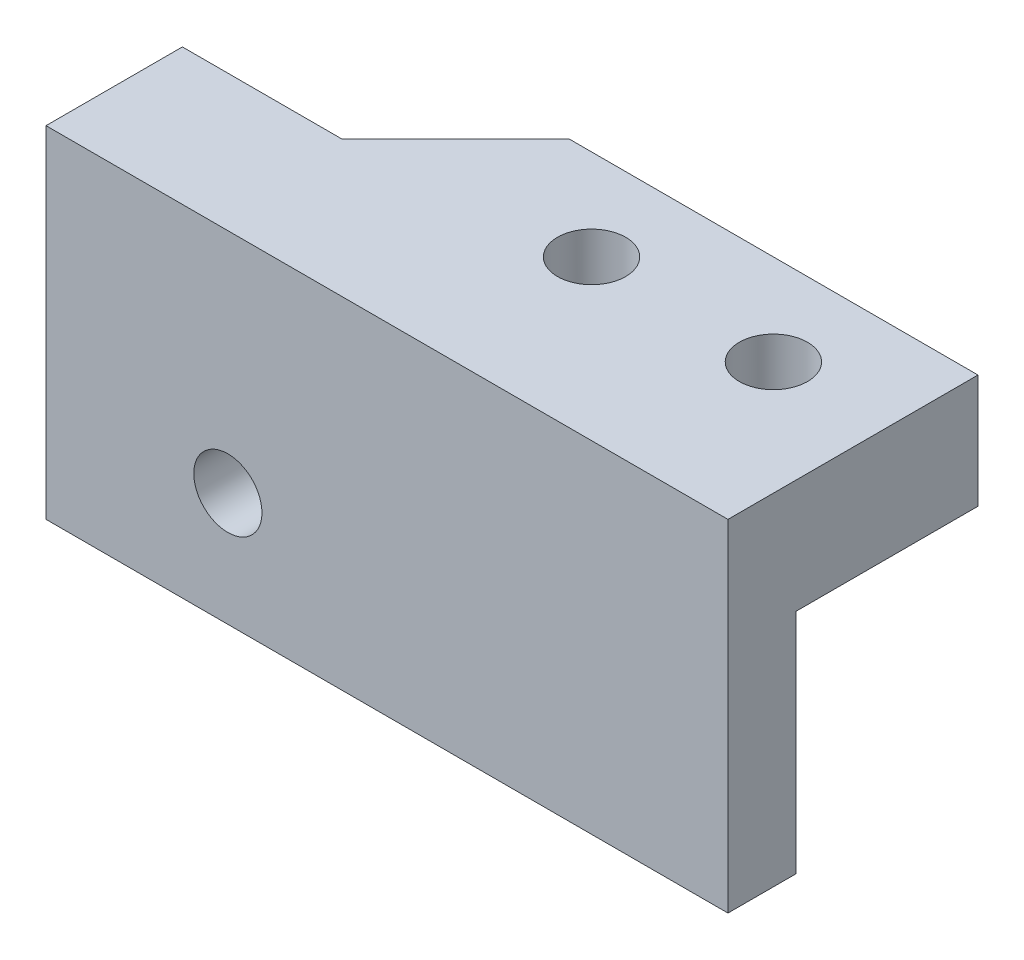
ISO-10303-21;
HEADER;
FILE_DESCRIPTION(('STEP AP214'),'2;1');
FILE_NAME('part.step','',(''),(''),'','','');
FILE_SCHEMA(('AUTOMOTIVE_DESIGN { 1 0 10303 214 1 1 1 1 }'));
ENDSEC;
DATA;
#1=APPLICATION_CONTEXT('core data for automotive mechanical design processes');
#2=APPLICATION_PROTOCOL_DEFINITION('international standard','automotive_design',2000,#1);
#3=PRODUCT_CONTEXT('',#1,'mechanical');
#4=PRODUCT('Part','Part','',(#3));
#5=PRODUCT_RELATED_PRODUCT_CATEGORY('part','',(#4));
#6=PRODUCT_DEFINITION_FORMATION('','',#4);
#7=PRODUCT_DEFINITION_CONTEXT('part definition',#1,'design');
#8=PRODUCT_DEFINITION('design','',#6,#7);
#9=PRODUCT_DEFINITION_SHAPE('','',#8);
#10=(LENGTH_UNIT() NAMED_UNIT(*) SI_UNIT(.MILLI.,.METRE.));
#11=(NAMED_UNIT(*) PLANE_ANGLE_UNIT() SI_UNIT($,.RADIAN.));
#12=(NAMED_UNIT(*) SI_UNIT($,.STERADIAN.) SOLID_ANGLE_UNIT());
#13=UNCERTAINTY_MEASURE_WITH_UNIT(LENGTH_MEASURE(1.E-05),#10,'distance_accuracy_value','');
#14=(GEOMETRIC_REPRESENTATION_CONTEXT(3) GLOBAL_UNCERTAINTY_ASSIGNED_CONTEXT((#13)) GLOBAL_UNIT_ASSIGNED_CONTEXT((#10,
#11,#12)) REPRESENTATION_CONTEXT('',''));
#15=CARTESIAN_POINT('',(0.,0.,0.));
#16=DIRECTION('',(0.,0.,1.));
#17=DIRECTION('',(1.,0.,0.));
#18=AXIS2_PLACEMENT_3D('',#15,#16,#17);
#19=CARTESIAN_POINT('',(0.,0.,11.));
#20=DIRECTION('',(0.,0.,-1.));
#21=DIRECTION('',(-1.,0.,0.));
#22=AXIS2_PLACEMENT_3D('',#19,#20,#21);
#23=PLANE('',#22);
#24=DIRECTION('',(0.,-1.,0.));
#25=VECTOR('',#24,1.);
#26=CARTESIAN_POINT('',(0.,0.,11.));
#27=LINE('',#26,#25);
#28=CARTESIAN_POINT('',(0.,15.,11.));
#29=VERTEX_POINT('',#28);
#30=CARTESIAN_POINT('',(0.,0.,11.));
#31=VERTEX_POINT('',#30);
#32=EDGE_CURVE('E154',#29,#31,#27,.T.);
#33=ORIENTED_EDGE('',*,*,#32,.T.);
#34=DIRECTION('',(1.,0.,0.));
#35=VECTOR('',#34,1.);
#36=CARTESIAN_POINT('',(0.,0.,11.));
#37=LINE('',#36,#35);
#38=CARTESIAN_POINT('',(30.,0.,11.));
#39=VERTEX_POINT('',#38);
#40=EDGE_CURVE('E158',#31,#39,#37,.T.);
#41=ORIENTED_EDGE('',*,*,#40,.T.);
#42=DIRECTION('',(0.,1.,0.));
#43=VECTOR('',#42,1.);
#44=CARTESIAN_POINT('',(30.,0.,11.));
#45=LINE('',#44,#43);
#46=CARTESIAN_POINT('',(30.,15.,11.));
#47=VERTEX_POINT('',#46);
#48=EDGE_CURVE('E162',#39,#47,#45,.T.);
#49=ORIENTED_EDGE('',*,*,#48,.T.);
#50=DIRECTION('',(-1.,0.,0.));
#51=VECTOR('',#50,1.);
#52=CARTESIAN_POINT('',(0.,15.,11.));
#53=LINE('',#52,#51);
#54=EDGE_CURVE('E165',#47,#29,#53,.T.);
#55=ORIENTED_EDGE('',*,*,#54,.T.);
#56=EDGE_LOOP('',(#33,#41,#49,#55));
#57=FACE_BOUND('',#56,.T.);
#58=CARTESIAN_POINT('',(8.,5.,11.));
#59=DIRECTION('',(0.,0.,1.));
#60=DIRECTION('',(1.,0.,0.));
#61=AXIS2_PLACEMENT_3D('',#58,#59,#60);
#62=CIRCLE('',#61,1.5);
#63=CARTESIAN_POINT('',(9.5,5.,11.));
#64=VERTEX_POINT('',#63);
#65=EDGE_CURVE('E149',#64,#64,#62,.T.);
#66=ORIENTED_EDGE('',*,*,#65,.F.);
#67=EDGE_LOOP('',(#66));
#68=FACE_BOUND('',#67,.T.);
#69=ADVANCED_FACE('F41',(#57,#68),#23,.F.);
#70=CARTESIAN_POINT('',(0.,0.,0.));
#71=DIRECTION('',(0.,0.,-1.));
#72=DIRECTION('',(-1.,0.,0.));
#73=AXIS2_PLACEMENT_3D('',#70,#71,#72);
#74=PLANE('',#73);
#75=DIRECTION('',(1.,0.,0.));
#76=VECTOR('',#75,1.);
#77=CARTESIAN_POINT('',(12.,10.,0.));
#78=LINE('',#77,#76);
#79=CARTESIAN_POINT('',(12.,10.,0.));
#80=VERTEX_POINT('',#79);
#81=CARTESIAN_POINT('',(30.,10.,0.));
#82=VERTEX_POINT('',#81);
#83=EDGE_CURVE('E115',#80,#82,#78,.T.);
#84=ORIENTED_EDGE('',*,*,#83,.F.);
#85=DIRECTION('',(0.,-1.,0.));
#86=VECTOR('',#85,1.);
#87=CARTESIAN_POINT('',(12.,20.,0.));
#88=LINE('',#87,#86);
#89=CARTESIAN_POINT('',(12.,15.,0.));
#90=VERTEX_POINT('',#89);
#91=EDGE_CURVE('E125',#90,#80,#88,.T.);
#92=ORIENTED_EDGE('',*,*,#91,.F.);
#93=DIRECTION('',(-1.,0.,0.));
#94=VECTOR('',#93,1.);
#95=CARTESIAN_POINT('',(0.,15.,0.));
#96=LINE('',#95,#94);
#97=CARTESIAN_POINT('',(30.,15.,0.));
#98=VERTEX_POINT('',#97);
#99=EDGE_CURVE('E159',#98,#90,#96,.T.);
#100=ORIENTED_EDGE('',*,*,#99,.F.);
#101=DIRECTION('',(0.,1.,0.));
#102=VECTOR('',#101,1.);
#103=CARTESIAN_POINT('',(30.,0.,0.));
#104=LINE('',#103,#102);
#105=EDGE_CURVE('E126',#82,#98,#104,.T.);
#106=ORIENTED_EDGE('',*,*,#105,.F.);
#107=EDGE_LOOP('',(#84,#92,#100,#106));
#108=FACE_BOUND('',#107,.T.);
#109=ADVANCED_FACE('F123',(#108),#74,.T.);
#110=CARTESIAN_POINT('',(0.,0.,11.));
#111=DIRECTION('',(1.,0.,0.));
#112=DIRECTION('',(0.,0.,-1.));
#113=AXIS2_PLACEMENT_3D('',#110,#111,#112);
#114=PLANE('',#113);
#115=DIRECTION('',(0.,0.,-1.));
#116=VECTOR('',#115,1.);
#117=CARTESIAN_POINT('',(0.,15.,11.));
#118=LINE('',#117,#116);
#119=CARTESIAN_POINT('',(0.,15.,5.));
#120=VERTEX_POINT('',#119);
#121=EDGE_CURVE('E168',#29,#120,#118,.T.);
#122=ORIENTED_EDGE('',*,*,#121,.T.);
#123=DIRECTION('',(0.,-1.,0.));
#124=VECTOR('',#123,1.);
#125=CARTESIAN_POINT('',(0.,20.,5.));
#126=LINE('',#125,#124);
#127=CARTESIAN_POINT('',(0.,0.,5.));
#128=VERTEX_POINT('',#127);
#129=EDGE_CURVE('E138',#120,#128,#126,.T.);
#130=ORIENTED_EDGE('',*,*,#129,.T.);
#131=DIRECTION('',(0.,0.,-1.));
#132=VECTOR('',#131,1.);
#133=CARTESIAN_POINT('',(0.,0.,11.));
#134=LINE('',#133,#132);
#135=EDGE_CURVE('E184',#31,#128,#134,.T.);
#136=ORIENTED_EDGE('',*,*,#135,.F.);
#137=ORIENTED_EDGE('',*,*,#32,.F.);
#138=EDGE_LOOP('',(#122,#130,#136,#137));
#139=FACE_BOUND('',#138,.T.);
#140=ADVANCED_FACE('F211',(#139),#114,.F.);
#141=CARTESIAN_POINT('',(0.,0.,11.));
#142=DIRECTION('',(0.,1.,0.));
#143=DIRECTION('',(0.,0.,1.));
#144=AXIS2_PLACEMENT_3D('',#141,#142,#143);
#145=PLANE('',#144);
#146=DIRECTION('',(-1.,0.,0.));
#147=VECTOR('',#146,1.);
#148=CARTESIAN_POINT('',(0.,0.,5.));
#149=LINE('',#148,#147);
#150=CARTESIAN_POINT('',(12.,0.,5.));
#151=VERTEX_POINT('',#150);
#152=EDGE_CURVE('E133',#151,#128,#149,.T.);
#153=ORIENTED_EDGE('',*,*,#152,.F.);
#154=DIRECTION('',(0.,0.,-1.));
#155=VECTOR('',#154,1.);
#156=CARTESIAN_POINT('',(12.,0.,0.));
#157=LINE('',#156,#155);
#158=CARTESIAN_POINT('',(12.,0.,8.));
#159=VERTEX_POINT('',#158);
#160=EDGE_CURVE('E230',#159,#151,#157,.T.);
#161=ORIENTED_EDGE('',*,*,#160,.F.);
#162=DIRECTION('',(-1.,0.,0.));
#163=VECTOR('',#162,1.);
#164=CARTESIAN_POINT('',(12.,0.,8.));
#165=LINE('',#164,#163);
#166=CARTESIAN_POINT('',(30.,0.,8.));
#167=VERTEX_POINT('',#166);
#168=EDGE_CURVE('E233',#167,#159,#165,.T.);
#169=ORIENTED_EDGE('',*,*,#168,.F.);
#170=DIRECTION('',(0.,0.,-1.));
#171=VECTOR('',#170,1.);
#172=CARTESIAN_POINT('',(30.,0.,11.));
#173=LINE('',#172,#171);
#174=EDGE_CURVE('E180',#39,#167,#173,.T.);
#175=ORIENTED_EDGE('',*,*,#174,.F.);
#176=ORIENTED_EDGE('',*,*,#40,.F.);
#177=ORIENTED_EDGE('',*,*,#135,.T.);
#178=EDGE_LOOP('',(#153,#161,#169,#175,#176,#177));
#179=FACE_BOUND('',#178,.T.);
#180=ADVANCED_FACE('F251',(#179),#145,.F.);
#181=CARTESIAN_POINT('',(30.,0.,11.));
#182=DIRECTION('',(-1.,0.,0.));
#183=DIRECTION('',(0.,0.,1.));
#184=AXIS2_PLACEMENT_3D('',#181,#182,#183);
#185=PLANE('',#184);
#186=ORIENTED_EDGE('',*,*,#174,.T.);
#187=DIRECTION('',(0.,-1.,0.));
#188=VECTOR('',#187,1.);
#189=CARTESIAN_POINT('',(30.,10.,8.));
#190=LINE('',#189,#188);
#191=CARTESIAN_POINT('',(30.,10.,8.));
#192=VERTEX_POINT('',#191);
#193=EDGE_CURVE('E220',#192,#167,#190,.T.);
#194=ORIENTED_EDGE('',*,*,#193,.F.);
#195=DIRECTION('',(0.,0.,1.));
#196=VECTOR('',#195,1.);
#197=CARTESIAN_POINT('',(30.,10.,0.));
#198=LINE('',#197,#196);
#199=EDGE_CURVE('E128',#82,#192,#198,.T.);
#200=ORIENTED_EDGE('',*,*,#199,.F.);
#201=ORIENTED_EDGE('',*,*,#105,.T.);
#202=DIRECTION('',(0.,0.,-1.));
#203=VECTOR('',#202,1.);
#204=CARTESIAN_POINT('',(30.,15.,11.));
#205=LINE('',#204,#203);
#206=EDGE_CURVE('E176',#47,#98,#205,.T.);
#207=ORIENTED_EDGE('',*,*,#206,.F.);
#208=ORIENTED_EDGE('',*,*,#48,.F.);
#209=EDGE_LOOP('',(#186,#194,#200,#201,#207,#208));
#210=FACE_BOUND('',#209,.T.);
#211=ADVANCED_FACE('F218',(#210),#185,.F.);
#212=CARTESIAN_POINT('',(0.,15.,11.));
#213=DIRECTION('',(0.,-1.,0.));
#214=DIRECTION('',(0.,0.,-1.));
#215=AXIS2_PLACEMENT_3D('',#212,#213,#214);
#216=PLANE('',#215);
#217=CARTESIAN_POINT('',(25.,15.,4.));
#218=DIRECTION('',(0.,-1.,0.));
#219=DIRECTION('',(0.,0.,-1.));
#220=AXIS2_PLACEMENT_3D('',#217,#218,#219);
#221=CIRCLE('',#220,1.5);
#222=CARTESIAN_POINT('',(25.,15.,2.5));
#223=VERTEX_POINT('',#222);
#224=EDGE_CURVE('E153',#223,#223,#221,.T.);
#225=ORIENTED_EDGE('',*,*,#224,.T.);
#226=EDGE_LOOP('',(#225));
#227=FACE_BOUND('',#226,.T.);
#228=CARTESIAN_POINT('',(17.,15.,4.));
#229=DIRECTION('',(0.,-1.,0.));
#230=DIRECTION('',(0.,0.,-1.));
#231=AXIS2_PLACEMENT_3D('',#228,#229,#230);
#232=CIRCLE('',#231,1.5);
#233=CARTESIAN_POINT('',(17.,15.,2.5));
#234=VERTEX_POINT('',#233);
#235=EDGE_CURVE('E147',#234,#234,#232,.T.);
#236=ORIENTED_EDGE('',*,*,#235,.T.);
#237=EDGE_LOOP('',(#236));
#238=FACE_BOUND('',#237,.T.);
#239=ORIENTED_EDGE('',*,*,#99,.T.);
#240=DIRECTION('',(0.70710678118655,0.,-0.707106781186545));
#241=VECTOR('',#240,1.);
#242=CARTESIAN_POINT('',(0.499999999999956,15.,11.5));
#243=LINE('',#242,#241);
#244=CARTESIAN_POINT('',(6.99999999999996,15.,5.));
#245=VERTEX_POINT('',#244);
#246=EDGE_CURVE('E11',#90,#245,#243,.F.);
#247=ORIENTED_EDGE('',*,*,#246,.T.);
#248=DIRECTION('',(-1.,0.,0.));
#249=VECTOR('',#248,1.);
#250=CARTESIAN_POINT('',(0.,15.,5.));
#251=LINE('',#250,#249);
#252=EDGE_CURVE('E144',#245,#120,#251,.T.);
#253=ORIENTED_EDGE('',*,*,#252,.T.);
#254=ORIENTED_EDGE('',*,*,#121,.F.);
#255=ORIENTED_EDGE('',*,*,#54,.F.);
#256=ORIENTED_EDGE('',*,*,#206,.T.);
#257=EDGE_LOOP('',(#239,#247,#253,#254,#255,#256));
#258=FACE_BOUND('',#257,.T.);
#259=ADVANCED_FACE('F206',(#227,#238,#258),#216,.F.);
#260=CARTESIAN_POINT('',(8.,5.,11.));
#261=DIRECTION('',(0.,0.,-1.));
#262=DIRECTION('',(-1.,0.,0.));
#263=AXIS2_PLACEMENT_3D('',#260,#261,#262);
#264=CYLINDRICAL_SURFACE('',#263,1.5);
#265=CARTESIAN_POINT('',(8.,5.,5.));
#266=DIRECTION('',(0.,0.,1.));
#267=DIRECTION('',(1.,0.,0.));
#268=AXIS2_PLACEMENT_3D('',#265,#266,#267);
#269=CIRCLE('',#268,1.5);
#270=CARTESIAN_POINT('',(9.5,5.,5.));
#271=VERTEX_POINT('',#270);
#272=EDGE_CURVE('E148',#271,#271,#269,.T.);
#273=ORIENTED_EDGE('',*,*,#272,.F.);
#274=EDGE_LOOP('',(#273));
#275=FACE_BOUND('',#274,.T.);
#276=ORIENTED_EDGE('',*,*,#65,.T.);
#277=EDGE_LOOP('',(#276));
#278=FACE_BOUND('',#277,.T.);
#279=ADVANCED_FACE('F277',(#275,#278),#264,.F.);
#280=CARTESIAN_POINT('',(17.,20.,4.));
#281=DIRECTION('',(0.,-1.,0.));
#282=DIRECTION('',(0.,0.,-1.));
#283=AXIS2_PLACEMENT_3D('',#280,#281,#282);
#284=CYLINDRICAL_SURFACE('',#283,1.5);
#285=CARTESIAN_POINT('',(17.,10.,4.));
#286=DIRECTION('',(0.,1.,0.));
#287=DIRECTION('',(0.,0.,1.));
#288=AXIS2_PLACEMENT_3D('',#285,#286,#287);
#289=CIRCLE('',#288,1.5);
#290=CARTESIAN_POINT('',(17.,10.,5.5));
#291=VERTEX_POINT('',#290);
#292=EDGE_CURVE('E140',#291,#291,#289,.F.);
#293=ORIENTED_EDGE('',*,*,#292,.T.);
#294=EDGE_LOOP('',(#293));
#295=FACE_BOUND('',#294,.T.);
#296=ORIENTED_EDGE('',*,*,#235,.F.);
#297=EDGE_LOOP('',(#296));
#298=FACE_BOUND('',#297,.T.);
#299=ADVANCED_FACE('F311',(#295,#298),#284,.F.);
#300=CARTESIAN_POINT('',(25.,20.,4.));
#301=DIRECTION('',(0.,-1.,0.));
#302=DIRECTION('',(0.,0.,-1.));
#303=AXIS2_PLACEMENT_3D('',#300,#301,#302);
#304=CYLINDRICAL_SURFACE('',#303,1.5);
#305=CARTESIAN_POINT('',(25.,10.,4.));
#306=DIRECTION('',(0.,1.,0.));
#307=DIRECTION('',(0.,0.,1.));
#308=AXIS2_PLACEMENT_3D('',#305,#306,#307);
#309=CIRCLE('',#308,1.5);
#310=CARTESIAN_POINT('',(25.,10.,5.5));
#311=VERTEX_POINT('',#310);
#312=EDGE_CURVE('E240',#311,#311,#309,.F.);
#313=ORIENTED_EDGE('',*,*,#312,.T.);
#314=EDGE_LOOP('',(#313));
#315=FACE_BOUND('',#314,.T.);
#316=ORIENTED_EDGE('',*,*,#224,.F.);
#317=EDGE_LOOP('',(#316));
#318=FACE_BOUND('',#317,.T.);
#319=ADVANCED_FACE('F317',(#315,#318),#304,.F.);
#320=CARTESIAN_POINT('',(0.,20.,5.));
#321=DIRECTION('',(0.,0.,1.));
#322=DIRECTION('',(1.,0.,0.));
#323=AXIS2_PLACEMENT_3D('',#320,#321,#322);
#324=PLANE('',#323);
#325=ORIENTED_EDGE('',*,*,#272,.T.);
#326=EDGE_LOOP('',(#325));
#327=FACE_BOUND('',#326,.T.);
#328=ORIENTED_EDGE('',*,*,#252,.F.);
#329=DIRECTION('',(0.,-1.,0.));
#330=VECTOR('',#329,1.);
#331=CARTESIAN_POINT('',(6.99999999999996,10.,5.));
#332=LINE('',#331,#330);
#333=CARTESIAN_POINT('',(6.99999999999996,10.,5.));
#334=VERTEX_POINT('',#333);
#335=EDGE_CURVE('E120',#245,#334,#332,.T.);
#336=ORIENTED_EDGE('',*,*,#335,.T.);
#337=DIRECTION('',(1.,0.,0.));
#338=VECTOR('',#337,1.);
#339=CARTESIAN_POINT('',(0.,10.,5.));
#340=LINE('',#339,#338);
#341=CARTESIAN_POINT('',(12.,10.,5.));
#342=VERTEX_POINT('',#341);
#343=EDGE_CURVE('E117',#334,#342,#340,.T.);
#344=ORIENTED_EDGE('',*,*,#343,.T.);
#345=DIRECTION('',(0.,-1.,0.));
#346=VECTOR('',#345,1.);
#347=CARTESIAN_POINT('',(12.,20.,5.));
#348=LINE('',#347,#346);
#349=EDGE_CURVE('E132',#342,#151,#348,.T.);
#350=ORIENTED_EDGE('',*,*,#349,.T.);
#351=ORIENTED_EDGE('',*,*,#152,.T.);
#352=ORIENTED_EDGE('',*,*,#129,.F.);
#353=EDGE_LOOP('',(#328,#336,#344,#350,#351,#352));
#354=FACE_BOUND('',#353,.T.);
#355=ADVANCED_FACE('F201',(#327,#354),#324,.F.);
#356=CARTESIAN_POINT('',(0.,10.,0.));
#357=DIRECTION('',(0.,1.,0.));
#358=DIRECTION('',(0.,0.,1.));
#359=AXIS2_PLACEMENT_3D('',#356,#357,#358);
#360=PLANE('',#359);
#361=ORIENTED_EDGE('',*,*,#312,.F.);
#362=EDGE_LOOP('',(#361));
#363=FACE_BOUND('',#362,.T.);
#364=DIRECTION('',(0.,0.,-1.));
#365=VECTOR('',#364,1.);
#366=CARTESIAN_POINT('',(12.,10.,0.));
#367=LINE('',#366,#365);
#368=CARTESIAN_POINT('',(12.,10.,8.));
#369=VERTEX_POINT('',#368);
#370=EDGE_CURVE('E129',#369,#342,#367,.T.);
#371=ORIENTED_EDGE('',*,*,#370,.T.);
#372=ORIENTED_EDGE('',*,*,#343,.F.);
#373=DIRECTION('',(-0.70710678118655,0.,0.707106781186545));
#374=VECTOR('',#373,1.);
#375=CARTESIAN_POINT('',(5.99999999999995,10.,6.));
#376=LINE('',#375,#374);
#377=EDGE_CURVE('E51',#334,#80,#376,.F.);
#378=ORIENTED_EDGE('',*,*,#377,.T.);
#379=ORIENTED_EDGE('',*,*,#83,.T.);
#380=ORIENTED_EDGE('',*,*,#199,.T.);
#381=DIRECTION('',(-1.,0.,0.));
#382=VECTOR('',#381,1.);
#383=CARTESIAN_POINT('',(12.,10.,8.));
#384=LINE('',#383,#382);
#385=EDGE_CURVE('E224',#192,#369,#384,.T.);
#386=ORIENTED_EDGE('',*,*,#385,.T.);
#387=EDGE_LOOP('',(#371,#372,#378,#379,#380,#386));
#388=FACE_BOUND('',#387,.T.);
#389=ORIENTED_EDGE('',*,*,#292,.F.);
#390=EDGE_LOOP('',(#389));
#391=FACE_BOUND('',#390,.T.);
#392=ADVANCED_FACE('F113',(#363,#388,#391),#360,.F.);
#393=CARTESIAN_POINT('',(12.,10.,0.));
#394=DIRECTION('',(-1.,0.,0.));
#395=DIRECTION('',(0.,0.,1.));
#396=AXIS2_PLACEMENT_3D('',#393,#394,#395);
#397=PLANE('',#396);
#398=ORIENTED_EDGE('',*,*,#370,.F.);
#399=DIRECTION('',(0.,-1.,0.));
#400=VECTOR('',#399,1.);
#401=CARTESIAN_POINT('',(12.,10.,8.));
#402=LINE('',#401,#400);
#403=EDGE_CURVE('E237',#369,#159,#402,.T.);
#404=ORIENTED_EDGE('',*,*,#403,.T.);
#405=ORIENTED_EDGE('',*,*,#160,.T.);
#406=ORIENTED_EDGE('',*,*,#349,.F.);
#407=EDGE_LOOP('',(#398,#404,#405,#406));
#408=FACE_BOUND('',#407,.T.);
#409=ADVANCED_FACE('F259',(#408),#397,.F.);
#410=CARTESIAN_POINT('',(12.,10.,8.));
#411=DIRECTION('',(0.,0.,1.));
#412=DIRECTION('',(1.,0.,0.));
#413=AXIS2_PLACEMENT_3D('',#410,#411,#412);
#414=PLANE('',#413);
#415=ORIENTED_EDGE('',*,*,#168,.T.);
#416=ORIENTED_EDGE('',*,*,#403,.F.);
#417=ORIENTED_EDGE('',*,*,#385,.F.);
#418=ORIENTED_EDGE('',*,*,#193,.T.);
#419=EDGE_LOOP('',(#415,#416,#417,#418));
#420=FACE_BOUND('',#419,.T.);
#421=ADVANCED_FACE('F255',(#420),#414,.F.);
#422=CARTESIAN_POINT('',(6.99999999999996,20.,5.));
#423=DIRECTION('',(-0.707106781186545,0.,-0.70710678118655));
#424=DIRECTION('',(0.,1.,0.));
#425=AXIS2_PLACEMENT_3D('',#422,#423,#424);
#426=PLANE('',#425);
#427=ORIENTED_EDGE('',*,*,#246,.F.);
#428=ORIENTED_EDGE('',*,*,#91,.T.);
#429=ORIENTED_EDGE('',*,*,#377,.F.);
#430=ORIENTED_EDGE('',*,*,#335,.F.);
#431=EDGE_LOOP('',(#427,#428,#429,#430));
#432=FACE_BOUND('',#431,.T.);
#433=ADVANCED_FACE('F44',(#432),#426,.T.);
#434=CLOSED_SHELL('',(#69,#109,#140,#180,#211,#259,#279,#299,#319,#355,#392,#409,#421,#433));
#435=MANIFOLD_SOLID_BREP('B2',#434);
#436=ADVANCED_BREP_SHAPE_REPRESENTATION('',(#18,#435),#14);
#437=SHAPE_DEFINITION_REPRESENTATION(#9,#436);
ENDSEC;
END-ISO-10303-21;
